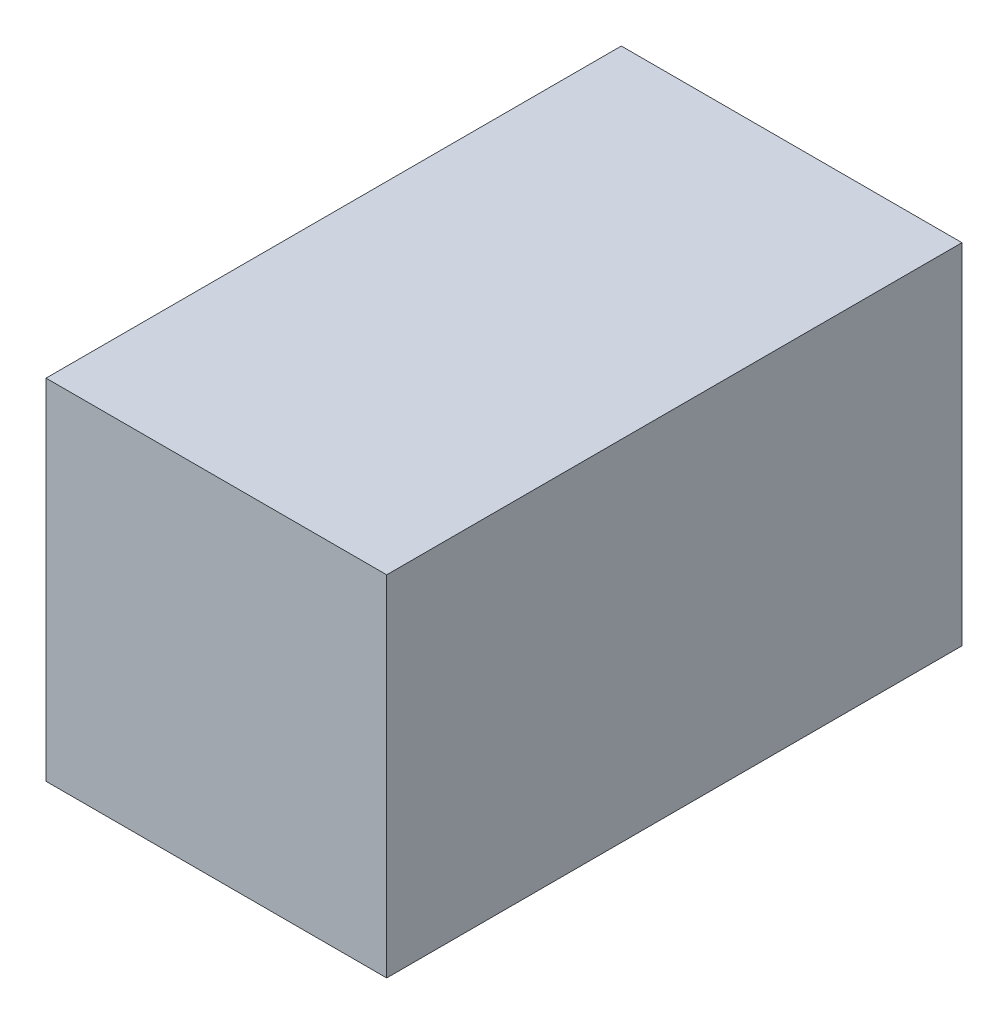
ISO-10303-21;
HEADER;
FILE_DESCRIPTION(('STEP AP214'),'2;1');
FILE_NAME('part.step','',(''),(''),'','','');
FILE_SCHEMA(('AUTOMOTIVE_DESIGN { 1 0 10303 214 1 1 1 1 }'));
ENDSEC;
DATA;
#1=APPLICATION_CONTEXT('core data for automotive mechanical design processes');
#2=APPLICATION_PROTOCOL_DEFINITION('international standard','automotive_design',2000,#1);
#3=PRODUCT_CONTEXT('',#1,'mechanical');
#4=PRODUCT('Part','Part','',(#3));
#5=PRODUCT_RELATED_PRODUCT_CATEGORY('part','',(#4));
#6=PRODUCT_DEFINITION_FORMATION('','',#4);
#7=PRODUCT_DEFINITION_CONTEXT('part definition',#1,'design');
#8=PRODUCT_DEFINITION('design','',#6,#7);
#9=PRODUCT_DEFINITION_SHAPE('','',#8);
#10=(LENGTH_UNIT() NAMED_UNIT(*) SI_UNIT(.MILLI.,.METRE.));
#11=(NAMED_UNIT(*) PLANE_ANGLE_UNIT() SI_UNIT($,.RADIAN.));
#12=(NAMED_UNIT(*) SI_UNIT($,.STERADIAN.) SOLID_ANGLE_UNIT());
#13=UNCERTAINTY_MEASURE_WITH_UNIT(LENGTH_MEASURE(1.E-05),#10,'distance_accuracy_value','');
#14=(GEOMETRIC_REPRESENTATION_CONTEXT(3) GLOBAL_UNCERTAINTY_ASSIGNED_CONTEXT((#13)) GLOBAL_UNIT_ASSIGNED_CONTEXT((#10,
#11,#12)) REPRESENTATION_CONTEXT('',''));
#15=CARTESIAN_POINT('',(0.,0.,0.));
#16=DIRECTION('',(0.,0.,1.));
#17=DIRECTION('',(1.,0.,0.));
#18=AXIS2_PLACEMENT_3D('',#15,#16,#17);
#19=CARTESIAN_POINT('',(-1.8542,-3.6704016,12.010009));
#20=DIRECTION('',(1.,0.,0.));
#21=DIRECTION('',(0.,0.,-1.));
#22=AXIS2_PLACEMENT_3D('',#19,#20,#21);
#23=PLANE('',#22);
#24=DIRECTION('',(0.,-1.,0.));
#25=VECTOR('',#24,1.);
#26=CARTESIAN_POINT('',(-1.8542,-3.6704016,0.));
#27=LINE('',#26,#25);
#28=CARTESIAN_POINT('',(-1.8542,3.6196016,0.));
#29=VERTEX_POINT('',#28);
#30=CARTESIAN_POINT('',(-1.8542,-3.6704016,0.));
#31=VERTEX_POINT('',#30);
#32=EDGE_CURVE('E95',#29,#31,#27,.T.);
#33=ORIENTED_EDGE('',*,*,#32,.T.);
#34=DIRECTION('',(0.,0.,-1.));
#35=VECTOR('',#34,1.);
#36=CARTESIAN_POINT('',(-1.8542,-3.6704016,12.010009));
#37=LINE('',#36,#35);
#38=CARTESIAN_POINT('',(-1.8542,-3.6704016,12.010009));
#39=VERTEX_POINT('',#38);
#40=EDGE_CURVE('E11',#39,#31,#37,.T.);
#41=ORIENTED_EDGE('',*,*,#40,.F.);
#42=DIRECTION('',(0.,-1.,0.));
#43=VECTOR('',#42,1.);
#44=CARTESIAN_POINT('',(-1.8542,-3.6704016,12.010009));
#45=LINE('',#44,#43);
#46=CARTESIAN_POINT('',(-1.8542,3.6196016,12.010009));
#47=VERTEX_POINT('',#46);
#48=EDGE_CURVE('E83',#47,#39,#45,.T.);
#49=ORIENTED_EDGE('',*,*,#48,.F.);
#50=DIRECTION('',(0.,0.,-1.));
#51=VECTOR('',#50,1.);
#52=CARTESIAN_POINT('',(-1.8542,3.6196016,12.010009));
#53=LINE('',#52,#51);
#54=EDGE_CURVE('E91',#47,#29,#53,.T.);
#55=ORIENTED_EDGE('',*,*,#54,.T.);
#56=EDGE_LOOP('',(#33,#41,#49,#55));
#57=FACE_BOUND('',#56,.T.);
#58=ADVANCED_FACE('F32',(#57),#23,.F.);
#59=CARTESIAN_POINT('',(5.2578,-3.6704016,12.010009));
#60=DIRECTION('',(0.,1.,0.));
#61=DIRECTION('',(0.,0.,1.));
#62=AXIS2_PLACEMENT_3D('',#59,#60,#61);
#63=PLANE('',#62);
#64=DIRECTION('',(1.,0.,0.));
#65=VECTOR('',#64,1.);
#66=CARTESIAN_POINT('',(5.2578,-3.6704016,0.));
#67=LINE('',#66,#65);
#68=CARTESIAN_POINT('',(5.2578,-3.6704016,0.));
#69=VERTEX_POINT('',#68);
#70=EDGE_CURVE('E87',#31,#69,#67,.T.);
#71=ORIENTED_EDGE('',*,*,#70,.T.);
#72=DIRECTION('',(0.,0.,-1.));
#73=VECTOR('',#72,1.);
#74=CARTESIAN_POINT('',(5.2578,-3.6704016,12.010009));
#75=LINE('',#74,#73);
#76=CARTESIAN_POINT('',(5.2578,-3.6704016,12.010009));
#77=VERTEX_POINT('',#76);
#78=EDGE_CURVE('E40',#77,#69,#75,.T.);
#79=ORIENTED_EDGE('',*,*,#78,.F.);
#80=DIRECTION('',(1.,0.,0.));
#81=VECTOR('',#80,1.);
#82=CARTESIAN_POINT('',(5.2578,-3.6704016,12.010009));
#83=LINE('',#82,#81);
#84=EDGE_CURVE('E78',#39,#77,#83,.T.);
#85=ORIENTED_EDGE('',*,*,#84,.F.);
#86=ORIENTED_EDGE('',*,*,#40,.T.);
#87=EDGE_LOOP('',(#71,#79,#85,#86));
#88=FACE_BOUND('',#87,.T.);
#89=ADVANCED_FACE('F86',(#88),#63,.F.);
#90=CARTESIAN_POINT('',(5.2578,3.6196016,12.010009));
#91=DIRECTION('',(-1.,0.,0.));
#92=DIRECTION('',(0.,0.,1.));
#93=AXIS2_PLACEMENT_3D('',#90,#91,#92);
#94=PLANE('',#93);
#95=DIRECTION('',(0.,1.,0.));
#96=VECTOR('',#95,1.);
#97=CARTESIAN_POINT('',(5.2578,3.6196016,0.));
#98=LINE('',#97,#96);
#99=CARTESIAN_POINT('',(5.2578,3.6196016,0.));
#100=VERTEX_POINT('',#99);
#101=EDGE_CURVE('E65',#69,#100,#98,.T.);
#102=ORIENTED_EDGE('',*,*,#101,.T.);
#103=DIRECTION('',(0.,0.,-1.));
#104=VECTOR('',#103,1.);
#105=CARTESIAN_POINT('',(5.2578,3.6196016,12.010009));
#106=LINE('',#105,#104);
#107=CARTESIAN_POINT('',(5.2578,3.6196016,12.010009));
#108=VERTEX_POINT('',#107);
#109=EDGE_CURVE('E88',#108,#100,#106,.T.);
#110=ORIENTED_EDGE('',*,*,#109,.F.);
#111=DIRECTION('',(0.,1.,0.));
#112=VECTOR('',#111,1.);
#113=CARTESIAN_POINT('',(5.2578,3.6196016,12.010009));
#114=LINE('',#113,#112);
#115=EDGE_CURVE('E81',#77,#108,#114,.T.);
#116=ORIENTED_EDGE('',*,*,#115,.F.);
#117=ORIENTED_EDGE('',*,*,#78,.T.);
#118=EDGE_LOOP('',(#102,#110,#116,#117));
#119=FACE_BOUND('',#118,.T.);
#120=ADVANCED_FACE('F89',(#119),#94,.F.);
#121=CARTESIAN_POINT('',(-1.8542,3.6196016,12.010009));
#122=DIRECTION('',(0.,-1.,0.));
#123=DIRECTION('',(0.,0.,-1.));
#124=AXIS2_PLACEMENT_3D('',#121,#122,#123);
#125=PLANE('',#124);
#126=DIRECTION('',(-1.,0.,0.));
#127=VECTOR('',#126,1.);
#128=CARTESIAN_POINT('',(-1.8542,3.6196016,0.));
#129=LINE('',#128,#127);
#130=EDGE_CURVE('E71',#100,#29,#129,.T.);
#131=ORIENTED_EDGE('',*,*,#130,.T.);
#132=ORIENTED_EDGE('',*,*,#54,.F.);
#133=DIRECTION('',(-1.,0.,0.));
#134=VECTOR('',#133,1.);
#135=CARTESIAN_POINT('',(-1.8542,3.6196016,12.010009));
#136=LINE('',#135,#134);
#137=EDGE_CURVE('E48',#108,#47,#136,.T.);
#138=ORIENTED_EDGE('',*,*,#137,.F.);
#139=ORIENTED_EDGE('',*,*,#109,.T.);
#140=EDGE_LOOP('',(#131,#132,#138,#139));
#141=FACE_BOUND('',#140,.T.);
#142=ADVANCED_FACE('F102',(#141),#125,.F.);
#143=CARTESIAN_POINT('',(0.,0.,12.010009));
#144=DIRECTION('',(0.,0.,-1.));
#145=DIRECTION('',(-1.,0.,0.));
#146=AXIS2_PLACEMENT_3D('',#143,#144,#145);
#147=PLANE('',#146);
#148=ORIENTED_EDGE('',*,*,#48,.T.);
#149=ORIENTED_EDGE('',*,*,#84,.T.);
#150=ORIENTED_EDGE('',*,*,#115,.T.);
#151=ORIENTED_EDGE('',*,*,#137,.T.);
#152=EDGE_LOOP('',(#148,#149,#150,#151));
#153=FACE_BOUND('',#152,.T.);
#154=ADVANCED_FACE('F79',(#153),#147,.F.);
#155=CARTESIAN_POINT('',(0.,0.,0.));
#156=DIRECTION('',(0.,0.,-1.));
#157=DIRECTION('',(-1.,0.,0.));
#158=AXIS2_PLACEMENT_3D('',#155,#156,#157);
#159=PLANE('',#158);
#160=ORIENTED_EDGE('',*,*,#32,.F.);
#161=ORIENTED_EDGE('',*,*,#130,.F.);
#162=ORIENTED_EDGE('',*,*,#101,.F.);
#163=ORIENTED_EDGE('',*,*,#70,.F.);
#164=EDGE_LOOP('',(#160,#161,#162,#163));
#165=FACE_BOUND('',#164,.T.);
#166=ADVANCED_FACE('F105',(#165),#159,.T.);
#167=CLOSED_SHELL('',(#58,#89,#120,#142,#154,#166));
#168=MANIFOLD_SOLID_BREP('B2',#167);
#169=ADVANCED_BREP_SHAPE_REPRESENTATION('',(#18,#168),#14);
#170=SHAPE_DEFINITION_REPRESENTATION(#9,#169);
ENDSEC;
END-ISO-10303-21;
